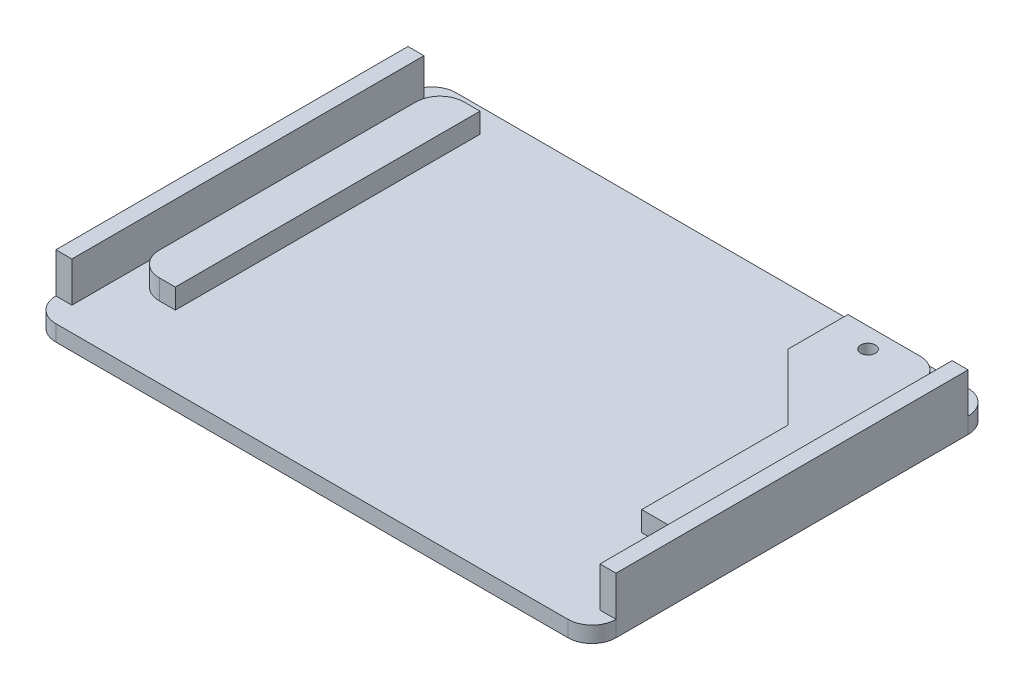
ISO-10303-21;
HEADER;
FILE_DESCRIPTION(('STEP AP214'),'2;1');
FILE_NAME('part.step','',(''),(''),'','','');
FILE_SCHEMA(('AUTOMOTIVE_DESIGN { 1 0 10303 214 1 1 1 1 }'));
ENDSEC;
DATA;
#1=APPLICATION_CONTEXT('core data for automotive mechanical design processes');
#2=APPLICATION_PROTOCOL_DEFINITION('international standard','automotive_design',2000,#1);
#3=PRODUCT_CONTEXT('',#1,'mechanical');
#4=PRODUCT('Part','Part','',(#3));
#5=PRODUCT_RELATED_PRODUCT_CATEGORY('part','',(#4));
#6=PRODUCT_DEFINITION_FORMATION('','',#4);
#7=PRODUCT_DEFINITION_CONTEXT('part definition',#1,'design');
#8=PRODUCT_DEFINITION('design','',#6,#7);
#9=PRODUCT_DEFINITION_SHAPE('','',#8);
#10=(LENGTH_UNIT() NAMED_UNIT(*) SI_UNIT(.MILLI.,.METRE.));
#11=(NAMED_UNIT(*) PLANE_ANGLE_UNIT() SI_UNIT($,.RADIAN.));
#12=(NAMED_UNIT(*) SI_UNIT($,.STERADIAN.) SOLID_ANGLE_UNIT());
#13=UNCERTAINTY_MEASURE_WITH_UNIT(LENGTH_MEASURE(1.E-05),#10,'distance_accuracy_value','');
#14=(GEOMETRIC_REPRESENTATION_CONTEXT(3) GLOBAL_UNCERTAINTY_ASSIGNED_CONTEXT((#13)) GLOBAL_UNIT_ASSIGNED_CONTEXT((#10,
#11,#12)) REPRESENTATION_CONTEXT('',''));
#15=CARTESIAN_POINT('',(0.,0.,0.));
#16=DIRECTION('',(0.,0.,1.));
#17=DIRECTION('',(1.,0.,0.));
#18=AXIS2_PLACEMENT_3D('',#15,#16,#17);
#19=CARTESIAN_POINT('',(0.,2.,0.));
#20=DIRECTION('',(0.,1.,0.));
#21=DIRECTION('',(0.,0.,1.));
#22=AXIS2_PLACEMENT_3D('',#19,#20,#21);
#23=PLANE('',#22);
#24=DIRECTION('',(-1.,0.,0.));
#25=VECTOR('',#24,1.);
#26=CARTESIAN_POINT('',(28.,2.,-22.9859711260623));
#27=LINE('',#26,#25);
#28=CARTESIAN_POINT('',(28.,2.,-22.9859711260623));
#29=VERTEX_POINT('',#28);
#30=CARTESIAN_POINT('',(19.,2.,-22.9859711260623));
#31=VERTEX_POINT('',#30);
#32=EDGE_CURVE('E303',#29,#31,#27,.T.);
#33=ORIENTED_EDGE('',*,*,#32,.F.);
#34=CARTESIAN_POINT('',(28.,2.,-19.9859711260623));
#35=DIRECTION('',(0.,1.,0.));
#36=DIRECTION('',(0.,0.,-1.));
#37=AXIS2_PLACEMENT_3D('',#34,#35,#36);
#38=CIRCLE('',#37,3.);
#39=CARTESIAN_POINT('',(31.,2.,-19.9859711260622));
#40=VERTEX_POINT('',#39);
#41=EDGE_CURVE('E254',#40,#29,#38,.T.);
#42=ORIENTED_EDGE('',*,*,#41,.F.);
#43=DIRECTION('',(0.,0.,-1.));
#44=VECTOR('',#43,1.);
#45=CARTESIAN_POINT('',(31.,2.,-19.9859711260622));
#46=LINE('',#45,#44);
#47=CARTESIAN_POINT('',(31.,2.,11.0140288739377));
#48=VERTEX_POINT('',#47);
#49=EDGE_CURVE('E281',#48,#40,#46,.T.);
#50=ORIENTED_EDGE('',*,*,#49,.F.);
#51=DIRECTION('',(1.,0.,0.));
#52=VECTOR('',#51,1.);
#53=CARTESIAN_POINT('',(31.,2.,11.0140288739377));
#54=LINE('',#53,#52);
#55=CARTESIAN_POINT('',(27.2221147720392,2.,11.0140288739377));
#56=VERTEX_POINT('',#55);
#57=EDGE_CURVE('E315',#56,#48,#54,.T.);
#58=ORIENTED_EDGE('',*,*,#57,.F.);
#59=DIRECTION('',(0.,0.,1.));
#60=VECTOR('',#59,1.);
#61=CARTESIAN_POINT('',(27.2221147720392,2.,-7.24392295753167));
#62=LINE('',#61,#60);
#63=CARTESIAN_POINT('',(27.2221147720392,2.,-7.24392295753167));
#64=VERTEX_POINT('',#63);
#65=EDGE_CURVE('E312',#64,#56,#62,.T.);
#66=ORIENTED_EDGE('',*,*,#65,.F.);
#67=DIRECTION('',(0.707106781186556,0.,0.707106781186539));
#68=VECTOR('',#67,1.);
#69=CARTESIAN_POINT('',(19.,2.,-15.4660377295707));
#70=LINE('',#69,#68);
#71=CARTESIAN_POINT('',(19.,2.,-15.4660377295707));
#72=VERTEX_POINT('',#71);
#73=EDGE_CURVE('E309',#72,#64,#70,.T.);
#74=ORIENTED_EDGE('',*,*,#73,.F.);
#75=DIRECTION('',(0.,0.,1.));
#76=VECTOR('',#75,1.);
#77=CARTESIAN_POINT('',(19.,2.,-22.9859711260623));
#78=LINE('',#77,#76);
#79=EDGE_CURVE('E306',#31,#72,#78,.T.);
#80=ORIENTED_EDGE('',*,*,#79,.F.);
#81=EDGE_LOOP('',(#33,#42,#50,#58,#66,#74,#80));
#82=FACE_BOUND('',#81,.T.);
#83=DIRECTION('',(0.,0.,1.));
#84=VECTOR('',#83,1.);
#85=CARTESIAN_POINT('',(33.,2.,-22.));
#86=LINE('',#85,#84);
#87=CARTESIAN_POINT('',(33.,2.,-22.));
#88=VERTEX_POINT('',#87);
#89=CARTESIAN_POINT('',(33.,2.,22.));
#90=VERTEX_POINT('',#89);
#91=EDGE_CURVE('E362',#88,#90,#86,.T.);
#92=ORIENTED_EDGE('',*,*,#91,.F.);
#93=DIRECTION('',(-1.,0.,0.));
#94=VECTOR('',#93,1.);
#95=CARTESIAN_POINT('',(35.,2.,-22.));
#96=LINE('',#95,#94);
#97=CARTESIAN_POINT('',(35.,2.,-22.));
#98=VERTEX_POINT('',#97);
#99=EDGE_CURVE('E367',#98,#88,#96,.T.);
#100=ORIENTED_EDGE('',*,*,#99,.F.);
#101=CARTESIAN_POINT('',(32.,2.,-22.));
#102=DIRECTION('',(0.,1.,0.));
#103=DIRECTION('',(0.,0.,1.));
#104=AXIS2_PLACEMENT_3D('',#101,#102,#103);
#105=CIRCLE('',#104,3.);
#106=CARTESIAN_POINT('',(32.,2.,-25.));
#107=VERTEX_POINT('',#106);
#108=EDGE_CURVE('E476',#98,#107,#105,.T.);
#109=ORIENTED_EDGE('',*,*,#108,.T.);
#110=DIRECTION('',(-1.,0.,0.));
#111=VECTOR('',#110,1.);
#112=CARTESIAN_POINT('',(-35.,2.,-25.));
#113=LINE('',#112,#111);
#114=CARTESIAN_POINT('',(-32.,2.,-25.));
#115=VERTEX_POINT('',#114);
#116=EDGE_CURVE('E423',#107,#115,#113,.T.);
#117=ORIENTED_EDGE('',*,*,#116,.T.);
#118=CARTESIAN_POINT('',(-32.,2.,-22.));
#119=DIRECTION('',(0.,1.,0.));
#120=DIRECTION('',(0.,0.,1.));
#121=AXIS2_PLACEMENT_3D('',#118,#119,#120);
#122=CIRCLE('',#121,3.);
#123=CARTESIAN_POINT('',(-35.,2.,-22.));
#124=VERTEX_POINT('',#123);
#125=EDGE_CURVE('E473',#115,#124,#122,.T.);
#126=ORIENTED_EDGE('',*,*,#125,.T.);
#127=DIRECTION('',(-1.,0.,0.));
#128=VECTOR('',#127,1.);
#129=CARTESIAN_POINT('',(-35.,2.,-22.));
#130=LINE('',#129,#128);
#131=CARTESIAN_POINT('',(-33.,2.,-22.));
#132=VERTEX_POINT('',#131);
#133=EDGE_CURVE('E387',#132,#124,#130,.T.);
#134=ORIENTED_EDGE('',*,*,#133,.F.);
#135=DIRECTION('',(0.,0.,-1.));
#136=VECTOR('',#135,1.);
#137=CARTESIAN_POINT('',(-33.,2.,-22.));
#138=LINE('',#137,#136);
#139=CARTESIAN_POINT('',(-33.,2.,22.));
#140=VERTEX_POINT('',#139);
#141=EDGE_CURVE('E400',#140,#132,#138,.T.);
#142=ORIENTED_EDGE('',*,*,#141,.F.);
#143=DIRECTION('',(1.,0.,0.));
#144=VECTOR('',#143,1.);
#145=CARTESIAN_POINT('',(-35.,2.,22.));
#146=LINE('',#145,#144);
#147=CARTESIAN_POINT('',(-35.,2.,22.));
#148=VERTEX_POINT('',#147);
#149=EDGE_CURVE('E370',#148,#140,#146,.T.);
#150=ORIENTED_EDGE('',*,*,#149,.F.);
#151=CARTESIAN_POINT('',(-32.,2.,22.));
#152=DIRECTION('',(0.,1.,0.));
#153=DIRECTION('',(0.,0.,1.));
#154=AXIS2_PLACEMENT_3D('',#151,#152,#153);
#155=CIRCLE('',#154,3.);
#156=CARTESIAN_POINT('',(-32.,2.,25.));
#157=VERTEX_POINT('',#156);
#158=EDGE_CURVE('E483',#148,#157,#155,.T.);
#159=ORIENTED_EDGE('',*,*,#158,.T.);
#160=DIRECTION('',(1.,0.,0.));
#161=VECTOR('',#160,1.);
#162=CARTESIAN_POINT('',(-35.,2.,25.));
#163=LINE('',#162,#161);
#164=CARTESIAN_POINT('',(32.,2.,25.));
#165=VERTEX_POINT('',#164);
#166=EDGE_CURVE('E427',#157,#165,#163,.T.);
#167=ORIENTED_EDGE('',*,*,#166,.T.);
#168=CARTESIAN_POINT('',(32.,2.,22.));
#169=DIRECTION('',(0.,1.,0.));
#170=DIRECTION('',(0.,0.,1.));
#171=AXIS2_PLACEMENT_3D('',#168,#169,#170);
#172=CIRCLE('',#171,3.);
#173=CARTESIAN_POINT('',(35.,2.,22.));
#174=VERTEX_POINT('',#173);
#175=EDGE_CURVE('E479',#165,#174,#172,.T.);
#176=ORIENTED_EDGE('',*,*,#175,.T.);
#177=DIRECTION('',(1.,0.,0.));
#178=VECTOR('',#177,1.);
#179=CARTESIAN_POINT('',(35.,2.,22.));
#180=LINE('',#179,#178);
#181=EDGE_CURVE('E359',#90,#174,#180,.T.);
#182=ORIENTED_EDGE('',*,*,#181,.F.);
#183=EDGE_LOOP('',(#92,#100,#109,#117,#126,#134,#142,#150,#159,#167,#176,#182));
#184=FACE_BOUND('',#183,.T.);
#185=DIRECTION('',(-1.,0.,0.));
#186=VECTOR('',#185,1.);
#187=CARTESIAN_POINT('',(-28.,2.,-22.));
#188=LINE('',#187,#186);
#189=CARTESIAN_POINT('',(-26.,2.,-22.));
#190=VERTEX_POINT('',#189);
#191=CARTESIAN_POINT('',(-28.,2.,-22.));
#192=VERTEX_POINT('',#191);
#193=EDGE_CURVE('E247',#190,#192,#188,.T.);
#194=ORIENTED_EDGE('',*,*,#193,.F.);
#195=DIRECTION('',(0.,0.,-1.));
#196=VECTOR('',#195,1.);
#197=CARTESIAN_POINT('',(-26.,2.,-22.));
#198=LINE('',#197,#196);
#199=CARTESIAN_POINT('',(-26.,2.,16.0717595554365));
#200=VERTEX_POINT('',#199);
#201=EDGE_CURVE('E240',#200,#190,#198,.T.);
#202=ORIENTED_EDGE('',*,*,#201,.F.);
#203=DIRECTION('',(1.,0.,0.));
#204=VECTOR('',#203,1.);
#205=CARTESIAN_POINT('',(-28.,2.,16.0717595554365));
#206=LINE('',#205,#204);
#207=CARTESIAN_POINT('',(-28.,2.,16.0717595554365));
#208=VERTEX_POINT('',#207);
#209=EDGE_CURVE('E224',#208,#200,#206,.T.);
#210=ORIENTED_EDGE('',*,*,#209,.F.);
#211=CARTESIAN_POINT('',(-28.,2.,13.0717595554365));
#212=DIRECTION('',(0.,1.,0.));
#213=DIRECTION('',(0.,0.,1.));
#214=AXIS2_PLACEMENT_3D('',#211,#212,#213);
#215=CIRCLE('',#214,3.);
#216=CARTESIAN_POINT('',(-31.,2.,13.0717595554365));
#217=VERTEX_POINT('',#216);
#218=EDGE_CURVE('E233',#217,#208,#215,.T.);
#219=ORIENTED_EDGE('',*,*,#218,.F.);
#220=DIRECTION('',(0.,0.,1.));
#221=VECTOR('',#220,1.);
#222=CARTESIAN_POINT('',(-31.,2.,-19.));
#223=LINE('',#222,#221);
#224=CARTESIAN_POINT('',(-31.,2.,-19.));
#225=VERTEX_POINT('',#224);
#226=EDGE_CURVE('E974',#225,#217,#223,.T.);
#227=ORIENTED_EDGE('',*,*,#226,.F.);
#228=CARTESIAN_POINT('',(-28.,2.,-19.));
#229=DIRECTION('',(0.,1.,0.));
#230=DIRECTION('',(0.,0.,1.));
#231=AXIS2_PLACEMENT_3D('',#228,#229,#230);
#232=CIRCLE('',#231,3.);
#233=EDGE_CURVE('E256',#192,#225,#232,.T.);
#234=ORIENTED_EDGE('',*,*,#233,.F.);
#235=EDGE_LOOP('',(#194,#202,#210,#219,#227,#234));
#236=FACE_BOUND('',#235,.T.);
#237=ADVANCED_FACE('F43',(#82,#184,#236),#23,.T.);
#238=CARTESIAN_POINT('',(35.,2.,-25.));
#239=DIRECTION('',(-1.,0.,0.));
#240=DIRECTION('',(0.,0.,1.));
#241=AXIS2_PLACEMENT_3D('',#238,#239,#240);
#242=PLANE('',#241);
#243=DIRECTION('',(0.,-1.,0.));
#244=VECTOR('',#243,1.);
#245=CARTESIAN_POINT('',(35.,2.,-22.));
#246=LINE('',#245,#244);
#247=CARTESIAN_POINT('',(35.,0.,-22.));
#248=VERTEX_POINT('',#247);
#249=EDGE_CURVE('E486',#248,#98,#246,.F.);
#250=ORIENTED_EDGE('',*,*,#249,.T.);
#251=DIRECTION('',(0.,-1.,0.));
#252=VECTOR('',#251,1.);
#253=CARTESIAN_POINT('',(35.,7.,-22.));
#254=LINE('',#253,#252);
#255=CARTESIAN_POINT('',(35.,7.,-22.));
#256=VERTEX_POINT('',#255);
#257=EDGE_CURVE('E344',#256,#98,#254,.T.);
#258=ORIENTED_EDGE('',*,*,#257,.F.);
#259=DIRECTION('',(0.,0.,-1.));
#260=VECTOR('',#259,1.);
#261=CARTESIAN_POINT('',(35.,7.,-22.));
#262=LINE('',#261,#260);
#263=CARTESIAN_POINT('',(35.,7.,22.));
#264=VERTEX_POINT('',#263);
#265=EDGE_CURVE('E363',#264,#256,#262,.T.);
#266=ORIENTED_EDGE('',*,*,#265,.F.);
#267=DIRECTION('',(0.,-1.,0.));
#268=VECTOR('',#267,1.);
#269=CARTESIAN_POINT('',(35.,7.,22.));
#270=LINE('',#269,#268);
#271=EDGE_CURVE('E354',#264,#174,#270,.T.);
#272=ORIENTED_EDGE('',*,*,#271,.T.);
#273=DIRECTION('',(0.,-1.,0.));
#274=VECTOR('',#273,1.);
#275=CARTESIAN_POINT('',(35.,2.,22.));
#276=LINE('',#275,#274);
#277=CARTESIAN_POINT('',(35.,0.,22.));
#278=VERTEX_POINT('',#277);
#279=EDGE_CURVE('E490',#174,#278,#276,.T.);
#280=ORIENTED_EDGE('',*,*,#279,.T.);
#281=DIRECTION('',(0.,0.,-1.));
#282=VECTOR('',#281,1.);
#283=CARTESIAN_POINT('',(35.,0.,-25.));
#284=LINE('',#283,#282);
#285=EDGE_CURVE('E422',#278,#248,#284,.T.);
#286=ORIENTED_EDGE('',*,*,#285,.T.);
#287=EDGE_LOOP('',(#250,#258,#266,#272,#280,#286));
#288=FACE_BOUND('',#287,.T.);
#289=ADVANCED_FACE('F545',(#288),#242,.F.);
#290=CARTESIAN_POINT('',(-35.,2.,-25.));
#291=DIRECTION('',(0.,0.,1.));
#292=DIRECTION('',(1.,0.,0.));
#293=AXIS2_PLACEMENT_3D('',#290,#291,#292);
#294=PLANE('',#293);
#295=ORIENTED_EDGE('',*,*,#116,.F.);
#296=DIRECTION('',(0.,-1.,0.));
#297=VECTOR('',#296,1.);
#298=CARTESIAN_POINT('',(32.,2.,-25.));
#299=LINE('',#298,#297);
#300=CARTESIAN_POINT('',(32.,0.,-25.));
#301=VERTEX_POINT('',#300);
#302=EDGE_CURVE('E52',#107,#301,#299,.T.);
#303=ORIENTED_EDGE('',*,*,#302,.T.);
#304=DIRECTION('',(-1.,0.,0.));
#305=VECTOR('',#304,1.);
#306=CARTESIAN_POINT('',(-35.,0.,-25.));
#307=LINE('',#306,#305);
#308=CARTESIAN_POINT('',(-32.,0.,-25.));
#309=VERTEX_POINT('',#308);
#310=EDGE_CURVE('E436',#301,#309,#307,.T.);
#311=ORIENTED_EDGE('',*,*,#310,.T.);
#312=DIRECTION('',(0.,-1.,0.));
#313=VECTOR('',#312,1.);
#314=CARTESIAN_POINT('',(-32.,2.,-25.));
#315=LINE('',#314,#313);
#316=EDGE_CURVE('E494',#309,#115,#315,.F.);
#317=ORIENTED_EDGE('',*,*,#316,.T.);
#318=EDGE_LOOP('',(#295,#303,#311,#317));
#319=FACE_BOUND('',#318,.T.);
#320=ADVANCED_FACE('F502',(#319),#294,.F.);
#321=CARTESIAN_POINT('',(-35.,2.,-25.));
#322=DIRECTION('',(1.,0.,0.));
#323=DIRECTION('',(0.,0.,-1.));
#324=AXIS2_PLACEMENT_3D('',#321,#322,#323);
#325=PLANE('',#324);
#326=DIRECTION('',(0.,0.,1.));
#327=VECTOR('',#326,1.);
#328=CARTESIAN_POINT('',(-35.,0.,-25.));
#329=LINE('',#328,#327);
#330=CARTESIAN_POINT('',(-35.,0.,-22.));
#331=VERTEX_POINT('',#330);
#332=CARTESIAN_POINT('',(-35.,0.,22.));
#333=VERTEX_POINT('',#332);
#334=EDGE_CURVE('E440',#331,#333,#329,.T.);
#335=ORIENTED_EDGE('',*,*,#334,.T.);
#336=DIRECTION('',(0.,-1.,0.));
#337=VECTOR('',#336,1.);
#338=CARTESIAN_POINT('',(-35.,2.,22.));
#339=LINE('',#338,#337);
#340=EDGE_CURVE('E469',#333,#148,#339,.F.);
#341=ORIENTED_EDGE('',*,*,#340,.T.);
#342=DIRECTION('',(0.,-1.,0.));
#343=VECTOR('',#342,1.);
#344=CARTESIAN_POINT('',(-35.,7.,22.));
#345=LINE('',#344,#343);
#346=CARTESIAN_POINT('',(-35.,7.,22.));
#347=VERTEX_POINT('',#346);
#348=EDGE_CURVE('E418',#347,#148,#345,.T.);
#349=ORIENTED_EDGE('',*,*,#348,.F.);
#350=DIRECTION('',(0.,0.,1.));
#351=VECTOR('',#350,1.);
#352=CARTESIAN_POINT('',(-35.,7.,-22.));
#353=LINE('',#352,#351);
#354=CARTESIAN_POINT('',(-35.,7.,-22.));
#355=VERTEX_POINT('',#354);
#356=EDGE_CURVE('E382',#355,#347,#353,.T.);
#357=ORIENTED_EDGE('',*,*,#356,.F.);
#358=DIRECTION('',(0.,-1.,0.));
#359=VECTOR('',#358,1.);
#360=CARTESIAN_POINT('',(-35.,7.,-22.));
#361=LINE('',#360,#359);
#362=EDGE_CURVE('E396',#355,#124,#361,.T.);
#363=ORIENTED_EDGE('',*,*,#362,.T.);
#364=DIRECTION('',(0.,-1.,0.));
#365=VECTOR('',#364,1.);
#366=CARTESIAN_POINT('',(-35.,2.,-22.));
#367=LINE('',#366,#365);
#368=EDGE_CURVE('E465',#124,#331,#367,.T.);
#369=ORIENTED_EDGE('',*,*,#368,.T.);
#370=EDGE_LOOP('',(#335,#341,#349,#357,#363,#369));
#371=FACE_BOUND('',#370,.T.);
#372=ADVANCED_FACE('F515',(#371),#325,.F.);
#373=CARTESIAN_POINT('',(-35.,2.,25.));
#374=DIRECTION('',(0.,0.,-1.));
#375=DIRECTION('',(-1.,0.,0.));
#376=AXIS2_PLACEMENT_3D('',#373,#374,#375);
#377=PLANE('',#376);
#378=ORIENTED_EDGE('',*,*,#166,.F.);
#379=DIRECTION('',(0.,-1.,0.));
#380=VECTOR('',#379,1.);
#381=CARTESIAN_POINT('',(-32.,2.,25.));
#382=LINE('',#381,#380);
#383=CARTESIAN_POINT('',(-32.,0.,25.));
#384=VERTEX_POINT('',#383);
#385=EDGE_CURVE('E449',#157,#384,#382,.T.);
#386=ORIENTED_EDGE('',*,*,#385,.T.);
#387=DIRECTION('',(1.,0.,0.));
#388=VECTOR('',#387,1.);
#389=CARTESIAN_POINT('',(-35.,0.,25.));
#390=LINE('',#389,#388);
#391=CARTESIAN_POINT('',(32.,0.,25.));
#392=VERTEX_POINT('',#391);
#393=EDGE_CURVE('E428',#384,#392,#390,.T.);
#394=ORIENTED_EDGE('',*,*,#393,.T.);
#395=DIRECTION('',(0.,-1.,0.));
#396=VECTOR('',#395,1.);
#397=CARTESIAN_POINT('',(32.,2.,25.));
#398=LINE('',#397,#396);
#399=EDGE_CURVE('E432',#392,#165,#398,.F.);
#400=ORIENTED_EDGE('',*,*,#399,.T.);
#401=EDGE_LOOP('',(#378,#386,#394,#400));
#402=FACE_BOUND('',#401,.T.);
#403=ADVANCED_FACE('F538',(#402),#377,.F.);
#404=CARTESIAN_POINT('',(0.,0.,0.));
#405=DIRECTION('',(0.,1.,0.));
#406=DIRECTION('',(0.,0.,1.));
#407=AXIS2_PLACEMENT_3D('',#404,#405,#406);
#408=PLANE('',#407);
#409=ORIENTED_EDGE('',*,*,#393,.F.);
#410=CARTESIAN_POINT('',(-32.,0.,22.));
#411=DIRECTION('',(0.,1.,0.));
#412=DIRECTION('',(0.,0.,1.));
#413=AXIS2_PLACEMENT_3D('',#410,#411,#412);
#414=CIRCLE('',#413,3.);
#415=EDGE_CURVE('E462',#384,#333,#414,.F.);
#416=ORIENTED_EDGE('',*,*,#415,.T.);
#417=ORIENTED_EDGE('',*,*,#334,.F.);
#418=CARTESIAN_POINT('',(-32.,0.,-22.));
#419=DIRECTION('',(0.,1.,0.));
#420=DIRECTION('',(0.,0.,1.));
#421=AXIS2_PLACEMENT_3D('',#418,#419,#420);
#422=CIRCLE('',#421,3.);
#423=EDGE_CURVE('E453',#331,#309,#422,.F.);
#424=ORIENTED_EDGE('',*,*,#423,.T.);
#425=ORIENTED_EDGE('',*,*,#310,.F.);
#426=CARTESIAN_POINT('',(32.,0.,-22.));
#427=DIRECTION('',(0.,1.,0.));
#428=DIRECTION('',(0.,0.,1.));
#429=AXIS2_PLACEMENT_3D('',#426,#427,#428);
#430=CIRCLE('',#429,3.);
#431=EDGE_CURVE('E456',#301,#248,#430,.F.);
#432=ORIENTED_EDGE('',*,*,#431,.T.);
#433=ORIENTED_EDGE('',*,*,#285,.F.);
#434=CARTESIAN_POINT('',(32.,0.,22.));
#435=DIRECTION('',(0.,1.,0.));
#436=DIRECTION('',(0.,0.,1.));
#437=AXIS2_PLACEMENT_3D('',#434,#435,#436);
#438=CIRCLE('',#437,3.);
#439=EDGE_CURVE('E459',#278,#392,#438,.F.);
#440=ORIENTED_EDGE('',*,*,#439,.T.);
#441=EDGE_LOOP('',(#409,#416,#417,#424,#425,#432,#433,#440));
#442=FACE_BOUND('',#441,.T.);
#443=ADVANCED_FACE('F508',(#442),#408,.F.);
#444=CARTESIAN_POINT('',(-32.,2.,22.));
#445=DIRECTION('',(0.,-1.,0.));
#446=DIRECTION('',(0.,0.,-1.));
#447=AXIS2_PLACEMENT_3D('',#444,#445,#446);
#448=CYLINDRICAL_SURFACE('',#447,3.);
#449=ORIENTED_EDGE('',*,*,#158,.F.);
#450=ORIENTED_EDGE('',*,*,#340,.F.);
#451=ORIENTED_EDGE('',*,*,#415,.F.);
#452=ORIENTED_EDGE('',*,*,#385,.F.);
#453=EDGE_LOOP('',(#449,#450,#451,#452));
#454=FACE_BOUND('',#453,.T.);
#455=ADVANCED_FACE('F536',(#454),#448,.T.);
#456=CARTESIAN_POINT('',(32.,2.,22.));
#457=DIRECTION('',(0.,-1.,0.));
#458=DIRECTION('',(0.,0.,-1.));
#459=AXIS2_PLACEMENT_3D('',#456,#457,#458);
#460=CYLINDRICAL_SURFACE('',#459,3.);
#461=ORIENTED_EDGE('',*,*,#175,.F.);
#462=ORIENTED_EDGE('',*,*,#399,.F.);
#463=ORIENTED_EDGE('',*,*,#439,.F.);
#464=ORIENTED_EDGE('',*,*,#279,.F.);
#465=EDGE_LOOP('',(#461,#462,#463,#464));
#466=FACE_BOUND('',#465,.T.);
#467=ADVANCED_FACE('F543',(#466),#460,.T.);
#468=CARTESIAN_POINT('',(32.,2.,-22.));
#469=DIRECTION('',(0.,-1.,0.));
#470=DIRECTION('',(0.,0.,-1.));
#471=AXIS2_PLACEMENT_3D('',#468,#469,#470);
#472=CYLINDRICAL_SURFACE('',#471,3.);
#473=ORIENTED_EDGE('',*,*,#108,.F.);
#474=ORIENTED_EDGE('',*,*,#249,.F.);
#475=ORIENTED_EDGE('',*,*,#431,.F.);
#476=ORIENTED_EDGE('',*,*,#302,.F.);
#477=EDGE_LOOP('',(#473,#474,#475,#476));
#478=FACE_BOUND('',#477,.T.);
#479=ADVANCED_FACE('F562',(#478),#472,.T.);
#480=CARTESIAN_POINT('',(-32.,2.,-22.));
#481=DIRECTION('',(0.,-1.,0.));
#482=DIRECTION('',(0.,0.,-1.));
#483=AXIS2_PLACEMENT_3D('',#480,#481,#482);
#484=CYLINDRICAL_SURFACE('',#483,3.);
#485=ORIENTED_EDGE('',*,*,#125,.F.);
#486=ORIENTED_EDGE('',*,*,#316,.F.);
#487=ORIENTED_EDGE('',*,*,#423,.F.);
#488=ORIENTED_EDGE('',*,*,#368,.F.);
#489=EDGE_LOOP('',(#485,#486,#487,#488));
#490=FACE_BOUND('',#489,.T.);
#491=ADVANCED_FACE('F45',(#490),#484,.T.);
#492=CARTESIAN_POINT('',(-35.,7.,22.));
#493=DIRECTION('',(0.,0.,-1.));
#494=DIRECTION('',(-1.,0.,0.));
#495=AXIS2_PLACEMENT_3D('',#492,#493,#494);
#496=PLANE('',#495);
#497=ORIENTED_EDGE('',*,*,#149,.T.);
#498=DIRECTION('',(0.,-1.,0.));
#499=VECTOR('',#498,1.);
#500=CARTESIAN_POINT('',(-33.,7.,22.));
#501=LINE('',#500,#499);
#502=CARTESIAN_POINT('',(-33.,7.,22.));
#503=VERTEX_POINT('',#502);
#504=EDGE_CURVE('E414',#503,#140,#501,.T.);
#505=ORIENTED_EDGE('',*,*,#504,.F.);
#506=DIRECTION('',(1.,0.,0.));
#507=VECTOR('',#506,1.);
#508=CARTESIAN_POINT('',(-35.,7.,22.));
#509=LINE('',#508,#507);
#510=EDGE_CURVE('E386',#347,#503,#509,.T.);
#511=ORIENTED_EDGE('',*,*,#510,.F.);
#512=ORIENTED_EDGE('',*,*,#348,.T.);
#513=EDGE_LOOP('',(#497,#505,#511,#512));
#514=FACE_BOUND('',#513,.T.);
#515=ADVANCED_FACE('F531',(#514),#496,.F.);
#516=CARTESIAN_POINT('',(-33.,7.,-22.));
#517=DIRECTION('',(-1.,0.,0.));
#518=DIRECTION('',(0.,0.,1.));
#519=AXIS2_PLACEMENT_3D('',#516,#517,#518);
#520=PLANE('',#519);
#521=ORIENTED_EDGE('',*,*,#141,.T.);
#522=DIRECTION('',(0.,-1.,0.));
#523=VECTOR('',#522,1.);
#524=CARTESIAN_POINT('',(-33.,7.,-22.));
#525=LINE('',#524,#523);
#526=CARTESIAN_POINT('',(-33.,7.,-22.));
#527=VERTEX_POINT('',#526);
#528=EDGE_CURVE('E410',#527,#132,#525,.T.);
#529=ORIENTED_EDGE('',*,*,#528,.F.);
#530=DIRECTION('',(0.,0.,-1.));
#531=VECTOR('',#530,1.);
#532=CARTESIAN_POINT('',(-33.,7.,-22.));
#533=LINE('',#532,#531);
#534=EDGE_CURVE('E390',#503,#527,#533,.T.);
#535=ORIENTED_EDGE('',*,*,#534,.F.);
#536=ORIENTED_EDGE('',*,*,#504,.T.);
#537=EDGE_LOOP('',(#521,#529,#535,#536));
#538=FACE_BOUND('',#537,.T.);
#539=ADVANCED_FACE('F527',(#538),#520,.F.);
#540=CARTESIAN_POINT('',(-35.,7.,-22.));
#541=DIRECTION('',(0.,0.,1.));
#542=DIRECTION('',(1.,0.,0.));
#543=AXIS2_PLACEMENT_3D('',#540,#541,#542);
#544=PLANE('',#543);
#545=ORIENTED_EDGE('',*,*,#133,.T.);
#546=ORIENTED_EDGE('',*,*,#362,.F.);
#547=DIRECTION('',(-1.,0.,0.));
#548=VECTOR('',#547,1.);
#549=CARTESIAN_POINT('',(-35.,7.,-22.));
#550=LINE('',#549,#548);
#551=EDGE_CURVE('E393',#527,#355,#550,.T.);
#552=ORIENTED_EDGE('',*,*,#551,.F.);
#553=ORIENTED_EDGE('',*,*,#528,.T.);
#554=EDGE_LOOP('',(#545,#546,#552,#553));
#555=FACE_BOUND('',#554,.T.);
#556=ADVANCED_FACE('F522',(#555),#544,.F.);
#557=CARTESIAN_POINT('',(0.,7.,0.));
#558=DIRECTION('',(0.,1.,0.));
#559=DIRECTION('',(0.,0.,1.));
#560=AXIS2_PLACEMENT_3D('',#557,#558,#559);
#561=PLANE('',#560);
#562=ORIENTED_EDGE('',*,*,#356,.T.);
#563=ORIENTED_EDGE('',*,*,#510,.T.);
#564=ORIENTED_EDGE('',*,*,#534,.T.);
#565=ORIENTED_EDGE('',*,*,#551,.T.);
#566=EDGE_LOOP('',(#562,#563,#564,#565));
#567=FACE_BOUND('',#566,.T.);
#568=ADVANCED_FACE('F633',(#567),#561,.T.);
#569=CARTESIAN_POINT('',(35.,7.,-22.));
#570=DIRECTION('',(0.,0.,1.));
#571=DIRECTION('',(1.,0.,0.));
#572=AXIS2_PLACEMENT_3D('',#569,#570,#571);
#573=PLANE('',#572);
#574=ORIENTED_EDGE('',*,*,#99,.T.);
#575=DIRECTION('',(0.,-1.,0.));
#576=VECTOR('',#575,1.);
#577=CARTESIAN_POINT('',(33.,7.,-22.));
#578=LINE('',#577,#576);
#579=CARTESIAN_POINT('',(33.,7.,-22.));
#580=VERTEX_POINT('',#579);
#581=EDGE_CURVE('E347',#580,#88,#578,.T.);
#582=ORIENTED_EDGE('',*,*,#581,.F.);
#583=DIRECTION('',(-1.,0.,0.));
#584=VECTOR('',#583,1.);
#585=CARTESIAN_POINT('',(35.,7.,-22.));
#586=LINE('',#585,#584);
#587=EDGE_CURVE('E376',#256,#580,#586,.T.);
#588=ORIENTED_EDGE('',*,*,#587,.F.);
#589=ORIENTED_EDGE('',*,*,#257,.T.);
#590=EDGE_LOOP('',(#574,#582,#588,#589));
#591=FACE_BOUND('',#590,.T.);
#592=ADVANCED_FACE('F561',(#591),#573,.F.);
#593=CARTESIAN_POINT('',(33.,7.,-22.));
#594=DIRECTION('',(1.,0.,0.));
#595=DIRECTION('',(0.,0.,-1.));
#596=AXIS2_PLACEMENT_3D('',#593,#594,#595);
#597=PLANE('',#596);
#598=ORIENTED_EDGE('',*,*,#91,.T.);
#599=DIRECTION('',(0.,-1.,0.));
#600=VECTOR('',#599,1.);
#601=CARTESIAN_POINT('',(33.,7.,22.));
#602=LINE('',#601,#600);
#603=CARTESIAN_POINT('',(33.,7.,22.));
#604=VERTEX_POINT('',#603);
#605=EDGE_CURVE('E351',#604,#90,#602,.T.);
#606=ORIENTED_EDGE('',*,*,#605,.F.);
#607=DIRECTION('',(0.,0.,1.));
#608=VECTOR('',#607,1.);
#609=CARTESIAN_POINT('',(33.,7.,-22.));
#610=LINE('',#609,#608);
#611=EDGE_CURVE('E373',#580,#604,#610,.T.);
#612=ORIENTED_EDGE('',*,*,#611,.F.);
#613=ORIENTED_EDGE('',*,*,#581,.T.);
#614=EDGE_LOOP('',(#598,#606,#612,#613));
#615=FACE_BOUND('',#614,.T.);
#616=ADVANCED_FACE('F558',(#615),#597,.F.);
#617=CARTESIAN_POINT('',(35.,7.,22.));
#618=DIRECTION('',(0.,0.,-1.));
#619=DIRECTION('',(-1.,0.,0.));
#620=AXIS2_PLACEMENT_3D('',#617,#618,#619);
#621=PLANE('',#620);
#622=ORIENTED_EDGE('',*,*,#181,.T.);
#623=ORIENTED_EDGE('',*,*,#271,.F.);
#624=DIRECTION('',(1.,0.,0.));
#625=VECTOR('',#624,1.);
#626=CARTESIAN_POINT('',(35.,7.,22.));
#627=LINE('',#626,#625);
#628=EDGE_CURVE('E358',#604,#264,#627,.T.);
#629=ORIENTED_EDGE('',*,*,#628,.F.);
#630=ORIENTED_EDGE('',*,*,#605,.T.);
#631=EDGE_LOOP('',(#622,#623,#629,#630));
#632=FACE_BOUND('',#631,.T.);
#633=ADVANCED_FACE('F554',(#632),#621,.F.);
#634=CARTESIAN_POINT('',(0.,7.,0.));
#635=DIRECTION('',(0.,-1.,0.));
#636=DIRECTION('',(0.,0.,-1.));
#637=AXIS2_PLACEMENT_3D('',#634,#635,#636);
#638=PLANE('',#637);
#639=ORIENTED_EDGE('',*,*,#265,.T.);
#640=ORIENTED_EDGE('',*,*,#587,.T.);
#641=ORIENTED_EDGE('',*,*,#611,.T.);
#642=ORIENTED_EDGE('',*,*,#628,.T.);
#643=EDGE_LOOP('',(#639,#640,#641,#642));
#644=FACE_BOUND('',#643,.T.);
#645=ADVANCED_FACE('F606',(#644),#638,.F.);
#646=CARTESIAN_POINT('',(28.,4.5,-19.9859711260623));
#647=DIRECTION('',(0.,-1.,0.));
#648=DIRECTION('',(0.,0.,-1.));
#649=AXIS2_PLACEMENT_3D('',#646,#647,#648);
#650=PLANE('',#649);
#651=CARTESIAN_POINT('',(28.,4.5,-19.9859711260623));
#652=DIRECTION('',(0.,1.,0.));
#653=DIRECTION('',(0.,0.,-1.));
#654=AXIS2_PLACEMENT_3D('',#651,#652,#653);
#655=CIRCLE('',#654,3.);
#656=CARTESIAN_POINT('',(31.,4.5,-19.9859711260622));
#657=VERTEX_POINT('',#656);
#658=CARTESIAN_POINT('',(28.,4.5,-22.9859711260623));
#659=VERTEX_POINT('',#658);
#660=EDGE_CURVE('E276',#657,#659,#655,.T.);
#661=ORIENTED_EDGE('',*,*,#660,.T.);
#662=DIRECTION('',(-1.,0.,0.));
#663=VECTOR('',#662,1.);
#664=CARTESIAN_POINT('',(28.,4.5,-22.9859711260623));
#665=LINE('',#664,#663);
#666=CARTESIAN_POINT('',(19.,4.5,-22.9859711260623));
#667=VERTEX_POINT('',#666);
#668=EDGE_CURVE('E280',#659,#667,#665,.T.);
#669=ORIENTED_EDGE('',*,*,#668,.T.);
#670=DIRECTION('',(0.,0.,1.));
#671=VECTOR('',#670,1.);
#672=CARTESIAN_POINT('',(19.,4.5,-22.9859711260623));
#673=LINE('',#672,#671);
#674=CARTESIAN_POINT('',(19.,4.5,-15.4660377295707));
#675=VERTEX_POINT('',#674);
#676=EDGE_CURVE('E284',#667,#675,#673,.T.);
#677=ORIENTED_EDGE('',*,*,#676,.T.);
#678=DIRECTION('',(0.707106781186556,0.,0.707106781186539));
#679=VECTOR('',#678,1.);
#680=CARTESIAN_POINT('',(19.,4.5,-15.4660377295707));
#681=LINE('',#680,#679);
#682=CARTESIAN_POINT('',(27.2221147720392,4.5,-7.24392295753167));
#683=VERTEX_POINT('',#682);
#684=EDGE_CURVE('E287',#675,#683,#681,.T.);
#685=ORIENTED_EDGE('',*,*,#684,.T.);
#686=DIRECTION('',(0.,0.,1.));
#687=VECTOR('',#686,1.);
#688=CARTESIAN_POINT('',(27.2221147720392,4.5,-7.24392295753167));
#689=LINE('',#688,#687);
#690=CARTESIAN_POINT('',(27.2221147720392,4.5,11.0140288739377));
#691=VERTEX_POINT('',#690);
#692=EDGE_CURVE('E290',#683,#691,#689,.T.);
#693=ORIENTED_EDGE('',*,*,#692,.T.);
#694=DIRECTION('',(1.,0.,0.));
#695=VECTOR('',#694,1.);
#696=CARTESIAN_POINT('',(31.,4.5,11.0140288739377));
#697=LINE('',#696,#695);
#698=CARTESIAN_POINT('',(31.,4.5,11.0140288739377));
#699=VERTEX_POINT('',#698);
#700=EDGE_CURVE('E293',#691,#699,#697,.T.);
#701=ORIENTED_EDGE('',*,*,#700,.T.);
#702=DIRECTION('',(0.,0.,-1.));
#703=VECTOR('',#702,1.);
#704=CARTESIAN_POINT('',(31.,4.5,-19.9859711260622));
#705=LINE('',#704,#703);
#706=EDGE_CURVE('E296',#699,#657,#705,.T.);
#707=ORIENTED_EDGE('',*,*,#706,.T.);
#708=EDGE_LOOP('',(#661,#669,#677,#685,#693,#701,#707));
#709=FACE_BOUND('',#708,.T.);
#710=CARTESIAN_POINT('',(24.,4.5,-20.492579920089));
#711=DIRECTION('',(0.,1.,0.));
#712=DIRECTION('',(0.,0.,1.));
#713=AXIS2_PLACEMENT_3D('',#710,#711,#712);
#714=CIRCLE('',#713,0.91);
#715=CARTESIAN_POINT('',(24.,4.5,-19.582579920089));
#716=VERTEX_POINT('',#715);
#717=EDGE_CURVE('E249',#716,#716,#714,.T.);
#718=ORIENTED_EDGE('',*,*,#717,.F.);
#719=EDGE_LOOP('',(#718));
#720=FACE_BOUND('',#719,.T.);
#721=ADVANCED_FACE('F603',(#709,#720),#650,.F.);
#722=CARTESIAN_POINT('',(28.,4.5,-19.9859711260623));
#723=DIRECTION('',(0.,-1.,0.));
#724=DIRECTION('',(0.,0.,-1.));
#725=AXIS2_PLACEMENT_3D('',#722,#723,#724);
#726=CYLINDRICAL_SURFACE('',#725,3.);
#727=ORIENTED_EDGE('',*,*,#41,.T.);
#728=DIRECTION('',(0.,-1.,0.));
#729=VECTOR('',#728,1.);
#730=CARTESIAN_POINT('',(28.,4.5,-22.9859711260623));
#731=LINE('',#730,#729);
#732=EDGE_CURVE('E341',#659,#29,#731,.T.);
#733=ORIENTED_EDGE('',*,*,#732,.F.);
#734=ORIENTED_EDGE('',*,*,#660,.F.);
#735=DIRECTION('',(0.,-1.,0.));
#736=VECTOR('',#735,1.);
#737=CARTESIAN_POINT('',(31.,4.5,-19.9859711260622));
#738=LINE('',#737,#736);
#739=EDGE_CURVE('E299',#657,#40,#738,.T.);
#740=ORIENTED_EDGE('',*,*,#739,.T.);
#741=EDGE_LOOP('',(#727,#733,#734,#740));
#742=FACE_BOUND('',#741,.T.);
#743=ADVANCED_FACE('F605',(#742),#726,.T.);
#744=CARTESIAN_POINT('',(28.,4.5,-22.9859711260623));
#745=DIRECTION('',(0.,0.,1.));
#746=DIRECTION('',(1.,0.,0.));
#747=AXIS2_PLACEMENT_3D('',#744,#745,#746);
#748=PLANE('',#747);
#749=ORIENTED_EDGE('',*,*,#32,.T.);
#750=DIRECTION('',(0.,-1.,0.));
#751=VECTOR('',#750,1.);
#752=CARTESIAN_POINT('',(19.,4.5,-22.9859711260623));
#753=LINE('',#752,#751);
#754=EDGE_CURVE('E337',#667,#31,#753,.T.);
#755=ORIENTED_EDGE('',*,*,#754,.F.);
#756=ORIENTED_EDGE('',*,*,#668,.F.);
#757=ORIENTED_EDGE('',*,*,#732,.T.);
#758=EDGE_LOOP('',(#749,#755,#756,#757));
#759=FACE_BOUND('',#758,.T.);
#760=ADVANCED_FACE('F623',(#759),#748,.F.);
#761=CARTESIAN_POINT('',(19.,4.5,-22.9859711260623));
#762=DIRECTION('',(1.,0.,0.));
#763=DIRECTION('',(0.,0.,-1.));
#764=AXIS2_PLACEMENT_3D('',#761,#762,#763);
#765=PLANE('',#764);
#766=ORIENTED_EDGE('',*,*,#79,.T.);
#767=DIRECTION('',(0.,-1.,0.));
#768=VECTOR('',#767,1.);
#769=CARTESIAN_POINT('',(19.,4.5,-15.4660377295707));
#770=LINE('',#769,#768);
#771=EDGE_CURVE('E333',#675,#72,#770,.T.);
#772=ORIENTED_EDGE('',*,*,#771,.F.);
#773=ORIENTED_EDGE('',*,*,#676,.F.);
#774=ORIENTED_EDGE('',*,*,#754,.T.);
#775=EDGE_LOOP('',(#766,#772,#773,#774));
#776=FACE_BOUND('',#775,.T.);
#777=ADVANCED_FACE('F619',(#776),#765,.F.);
#778=CARTESIAN_POINT('',(19.,4.5,-15.4660377295707));
#779=DIRECTION('',(0.707106781186539,0.,-0.707106781186556));
#780=DIRECTION('',(-0.707106781186556,0.,-0.707106781186539));
#781=AXIS2_PLACEMENT_3D('',#778,#779,#780);
#782=PLANE('',#781);
#783=ORIENTED_EDGE('',*,*,#73,.T.);
#784=DIRECTION('',(0.,-1.,0.));
#785=VECTOR('',#784,1.);
#786=CARTESIAN_POINT('',(27.2221147720392,4.5,-7.24392295753167));
#787=LINE('',#786,#785);
#788=EDGE_CURVE('E329',#683,#64,#787,.T.);
#789=ORIENTED_EDGE('',*,*,#788,.F.);
#790=ORIENTED_EDGE('',*,*,#684,.F.);
#791=ORIENTED_EDGE('',*,*,#771,.T.);
#792=EDGE_LOOP('',(#783,#789,#790,#791));
#793=FACE_BOUND('',#792,.T.);
#794=ADVANCED_FACE('F615',(#793),#782,.F.);
#795=CARTESIAN_POINT('',(27.2221147720392,4.5,-7.24392295753167));
#796=DIRECTION('',(1.,0.,0.));
#797=DIRECTION('',(0.,0.,-1.));
#798=AXIS2_PLACEMENT_3D('',#795,#796,#797);
#799=PLANE('',#798);
#800=ORIENTED_EDGE('',*,*,#65,.T.);
#801=DIRECTION('',(0.,-1.,0.));
#802=VECTOR('',#801,1.);
#803=CARTESIAN_POINT('',(27.2221147720392,4.5,11.0140288739377));
#804=LINE('',#803,#802);
#805=EDGE_CURVE('E325',#691,#56,#804,.T.);
#806=ORIENTED_EDGE('',*,*,#805,.F.);
#807=ORIENTED_EDGE('',*,*,#692,.F.);
#808=ORIENTED_EDGE('',*,*,#788,.T.);
#809=EDGE_LOOP('',(#800,#806,#807,#808));
#810=FACE_BOUND('',#809,.T.);
#811=ADVANCED_FACE('F611',(#810),#799,.F.);
#812=CARTESIAN_POINT('',(31.,4.5,11.0140288739377));
#813=DIRECTION('',(0.,0.,-1.));
#814=DIRECTION('',(-1.,0.,0.));
#815=AXIS2_PLACEMENT_3D('',#812,#813,#814);
#816=PLANE('',#815);
#817=ORIENTED_EDGE('',*,*,#57,.T.);
#818=DIRECTION('',(0.,-1.,0.));
#819=VECTOR('',#818,1.);
#820=CARTESIAN_POINT('',(31.,4.5,11.0140288739377));
#821=LINE('',#820,#819);
#822=EDGE_CURVE('E67',#699,#48,#821,.T.);
#823=ORIENTED_EDGE('',*,*,#822,.F.);
#824=ORIENTED_EDGE('',*,*,#700,.F.);
#825=ORIENTED_EDGE('',*,*,#805,.T.);
#826=EDGE_LOOP('',(#817,#823,#824,#825));
#827=FACE_BOUND('',#826,.T.);
#828=ADVANCED_FACE('F597',(#827),#816,.F.);
#829=CARTESIAN_POINT('',(31.,4.5,-19.9859711260622));
#830=DIRECTION('',(-1.,0.,0.));
#831=DIRECTION('',(0.,0.,1.));
#832=AXIS2_PLACEMENT_3D('',#829,#830,#831);
#833=PLANE('',#832);
#834=ORIENTED_EDGE('',*,*,#49,.T.);
#835=ORIENTED_EDGE('',*,*,#739,.F.);
#836=ORIENTED_EDGE('',*,*,#706,.F.);
#837=ORIENTED_EDGE('',*,*,#822,.T.);
#838=EDGE_LOOP('',(#834,#835,#836,#837));
#839=FACE_BOUND('',#838,.T.);
#840=ADVANCED_FACE('F589',(#839),#833,.F.);
#841=CARTESIAN_POINT('',(24.,4.5,-20.492579920089));
#842=DIRECTION('',(0.,-1.,0.));
#843=DIRECTION('',(0.,0.,-1.));
#844=AXIS2_PLACEMENT_3D('',#841,#842,#843);
#845=CYLINDRICAL_SURFACE('',#844,0.91);
#846=ORIENTED_EDGE('',*,*,#717,.T.);
#847=EDGE_LOOP('',(#846));
#848=FACE_BOUND('',#847,.T.);
#849=CARTESIAN_POINT('',(24.,2.,-20.492579920089));
#850=DIRECTION('',(0.,1.,0.));
#851=DIRECTION('',(0.,0.,1.));
#852=AXIS2_PLACEMENT_3D('',#849,#850,#851);
#853=CIRCLE('',#852,0.91);
#854=CARTESIAN_POINT('',(24.,2.,-19.582579920089));
#855=VERTEX_POINT('',#854);
#856=EDGE_CURVE('E11',#855,#855,#853,.F.);
#857=ORIENTED_EDGE('',*,*,#856,.T.);
#858=EDGE_LOOP('',(#857));
#859=FACE_BOUND('',#858,.T.);
#860=ADVANCED_FACE('F581',(#848,#859),#845,.F.);
#861=ORIENTED_EDGE('',*,*,#856,.F.);
#862=EDGE_LOOP('',(#861));
#863=FACE_BOUND('',#862,.T.);
#864=ADVANCED_FACE('F572',(#863),#23,.T.);
#865=CARTESIAN_POINT('',(-26.,4.5,-22.));
#866=DIRECTION('',(-1.,0.,0.));
#867=DIRECTION('',(0.,0.,1.));
#868=AXIS2_PLACEMENT_3D('',#865,#866,#867);
#869=PLANE('',#868);
#870=ORIENTED_EDGE('',*,*,#201,.T.);
#871=DIRECTION('',(0.,-1.,0.));
#872=VECTOR('',#871,1.);
#873=CARTESIAN_POINT('',(-26.,4.5,-22.));
#874=LINE('',#873,#872);
#875=CARTESIAN_POINT('',(-26.,4.5,-22.));
#876=VERTEX_POINT('',#875);
#877=EDGE_CURVE('E954',#876,#190,#874,.T.);
#878=ORIENTED_EDGE('',*,*,#877,.F.);
#879=DIRECTION('',(0.,0.,-1.));
#880=VECTOR('',#879,1.);
#881=CARTESIAN_POINT('',(-26.,4.5,-22.));
#882=LINE('',#881,#880);
#883=CARTESIAN_POINT('',(-26.,4.5,16.0717595554365));
#884=VERTEX_POINT('',#883);
#885=EDGE_CURVE('E234',#884,#876,#882,.T.);
#886=ORIENTED_EDGE('',*,*,#885,.F.);
#887=DIRECTION('',(0.,-1.,0.));
#888=VECTOR('',#887,1.);
#889=CARTESIAN_POINT('',(-26.,4.5,16.0717595554365));
#890=LINE('',#889,#888);
#891=EDGE_CURVE('E227',#884,#200,#890,.T.);
#892=ORIENTED_EDGE('',*,*,#891,.T.);
#893=EDGE_LOOP('',(#870,#878,#886,#892));
#894=FACE_BOUND('',#893,.T.);
#895=ADVANCED_FACE('F238',(#894),#869,.F.);
#896=CARTESIAN_POINT('',(-28.,4.5,-22.));
#897=DIRECTION('',(0.,0.,1.));
#898=DIRECTION('',(1.,0.,0.));
#899=AXIS2_PLACEMENT_3D('',#896,#897,#898);
#900=PLANE('',#899);
#901=ORIENTED_EDGE('',*,*,#193,.T.);
#902=DIRECTION('',(0.,-1.,0.));
#903=VECTOR('',#902,1.);
#904=CARTESIAN_POINT('',(-28.,4.5,-22.));
#905=LINE('',#904,#903);
#906=CARTESIAN_POINT('',(-28.,4.5,-22.));
#907=VERTEX_POINT('',#906);
#908=EDGE_CURVE('E956',#907,#192,#905,.T.);
#909=ORIENTED_EDGE('',*,*,#908,.F.);
#910=DIRECTION('',(-1.,0.,0.));
#911=VECTOR('',#910,1.);
#912=CARTESIAN_POINT('',(-28.,4.5,-22.));
#913=LINE('',#912,#911);
#914=EDGE_CURVE('E271',#876,#907,#913,.T.);
#915=ORIENTED_EDGE('',*,*,#914,.F.);
#916=ORIENTED_EDGE('',*,*,#877,.T.);
#917=EDGE_LOOP('',(#901,#909,#915,#916));
#918=FACE_BOUND('',#917,.T.);
#919=ADVANCED_FACE('F587',(#918),#900,.F.);
#920=CARTESIAN_POINT('',(-28.,4.5,-19.));
#921=DIRECTION('',(0.,-1.,0.));
#922=DIRECTION('',(0.,0.,-1.));
#923=AXIS2_PLACEMENT_3D('',#920,#921,#922);
#924=CYLINDRICAL_SURFACE('',#923,3.);
#925=ORIENTED_EDGE('',*,*,#233,.T.);
#926=DIRECTION('',(0.,-1.,0.));
#927=VECTOR('',#926,1.);
#928=CARTESIAN_POINT('',(-31.,4.5,-19.));
#929=LINE('',#928,#927);
#930=CARTESIAN_POINT('',(-31.,4.5,-19.));
#931=VERTEX_POINT('',#930);
#932=EDGE_CURVE('E960',#931,#225,#929,.T.);
#933=ORIENTED_EDGE('',*,*,#932,.F.);
#934=CARTESIAN_POINT('',(-28.,4.5,-19.));
#935=DIRECTION('',(0.,1.,0.));
#936=DIRECTION('',(0.,0.,1.));
#937=AXIS2_PLACEMENT_3D('',#934,#935,#936);
#938=CIRCLE('',#937,3.);
#939=EDGE_CURVE('E268',#907,#931,#938,.T.);
#940=ORIENTED_EDGE('',*,*,#939,.F.);
#941=ORIENTED_EDGE('',*,*,#908,.T.);
#942=EDGE_LOOP('',(#925,#933,#940,#941));
#943=FACE_BOUND('',#942,.T.);
#944=ADVANCED_FACE('F740',(#943),#924,.T.);
#945=CARTESIAN_POINT('',(-31.,4.5,-19.));
#946=DIRECTION('',(1.,0.,0.));
#947=DIRECTION('',(0.,0.,-1.));
#948=AXIS2_PLACEMENT_3D('',#945,#946,#947);
#949=PLANE('',#948);
#950=ORIENTED_EDGE('',*,*,#226,.T.);
#951=DIRECTION('',(0.,-1.,0.));
#952=VECTOR('',#951,1.);
#953=CARTESIAN_POINT('',(-31.,4.5,13.0717595554365));
#954=LINE('',#953,#952);
#955=CARTESIAN_POINT('',(-31.,4.5,13.0717595554365));
#956=VERTEX_POINT('',#955);
#957=EDGE_CURVE('E966',#956,#217,#954,.T.);
#958=ORIENTED_EDGE('',*,*,#957,.F.);
#959=DIRECTION('',(0.,0.,1.));
#960=VECTOR('',#959,1.);
#961=CARTESIAN_POINT('',(-31.,4.5,-19.));
#962=LINE('',#961,#960);
#963=EDGE_CURVE('E265',#931,#956,#962,.T.);
#964=ORIENTED_EDGE('',*,*,#963,.F.);
#965=ORIENTED_EDGE('',*,*,#932,.T.);
#966=EDGE_LOOP('',(#950,#958,#964,#965));
#967=FACE_BOUND('',#966,.T.);
#968=ADVANCED_FACE('F751',(#967),#949,.F.);
#969=CARTESIAN_POINT('',(-28.,4.5,13.0717595554365));
#970=DIRECTION('',(0.,-1.,0.));
#971=DIRECTION('',(0.,0.,-1.));
#972=AXIS2_PLACEMENT_3D('',#969,#970,#971);
#973=CYLINDRICAL_SURFACE('',#972,3.);
#974=ORIENTED_EDGE('',*,*,#218,.T.);
#975=DIRECTION('',(0.,-1.,0.));
#976=VECTOR('',#975,1.);
#977=CARTESIAN_POINT('',(-28.,4.5,16.0717595554365));
#978=LINE('',#977,#976);
#979=CARTESIAN_POINT('',(-28.,4.5,16.0717595554365));
#980=VERTEX_POINT('',#979);
#981=EDGE_CURVE('E59',#980,#208,#978,.T.);
#982=ORIENTED_EDGE('',*,*,#981,.F.);
#983=CARTESIAN_POINT('',(-28.,4.5,13.0717595554365));
#984=DIRECTION('',(0.,1.,0.));
#985=DIRECTION('',(0.,0.,1.));
#986=AXIS2_PLACEMENT_3D('',#983,#984,#985);
#987=CIRCLE('',#986,3.);
#988=EDGE_CURVE('E262',#956,#980,#987,.T.);
#989=ORIENTED_EDGE('',*,*,#988,.F.);
#990=ORIENTED_EDGE('',*,*,#957,.T.);
#991=EDGE_LOOP('',(#974,#982,#989,#990));
#992=FACE_BOUND('',#991,.T.);
#993=ADVANCED_FACE('F762',(#992),#973,.T.);
#994=CARTESIAN_POINT('',(-28.,4.5,16.0717595554365));
#995=DIRECTION('',(0.,0.,-1.));
#996=DIRECTION('',(-1.,0.,0.));
#997=AXIS2_PLACEMENT_3D('',#994,#995,#996);
#998=PLANE('',#997);
#999=ORIENTED_EDGE('',*,*,#209,.T.);
#1000=ORIENTED_EDGE('',*,*,#891,.F.);
#1001=DIRECTION('',(1.,0.,0.));
#1002=VECTOR('',#1001,1.);
#1003=CARTESIAN_POINT('',(-28.,4.5,16.0717595554365));
#1004=LINE('',#1003,#1002);
#1005=EDGE_CURVE('E244',#980,#884,#1004,.T.);
#1006=ORIENTED_EDGE('',*,*,#1005,.F.);
#1007=ORIENTED_EDGE('',*,*,#981,.T.);
#1008=EDGE_LOOP('',(#999,#1000,#1006,#1007));
#1009=FACE_BOUND('',#1008,.T.);
#1010=ADVANCED_FACE('F226',(#1009),#998,.F.);
#1011=CARTESIAN_POINT('',(-28.,4.5,13.0717595554365));
#1012=DIRECTION('',(0.,1.,0.));
#1013=DIRECTION('',(0.,0.,1.));
#1014=AXIS2_PLACEMENT_3D('',#1011,#1012,#1013);
#1015=PLANE('',#1014);
#1016=ORIENTED_EDGE('',*,*,#885,.T.);
#1017=ORIENTED_EDGE('',*,*,#914,.T.);
#1018=ORIENTED_EDGE('',*,*,#939,.T.);
#1019=ORIENTED_EDGE('',*,*,#963,.T.);
#1020=ORIENTED_EDGE('',*,*,#988,.T.);
#1021=ORIENTED_EDGE('',*,*,#1005,.T.);
#1022=EDGE_LOOP('',(#1016,#1017,#1018,#1019,#1020,#1021));
#1023=FACE_BOUND('',#1022,.T.);
#1024=ADVANCED_FACE('F601',(#1023),#1015,.T.);
#1025=CLOSED_SHELL('',(#237,#289,#320,#372,#403,#443,#455,#467,#479,#491,#515,#539,#556,#568,
#592,#616,#633,#645,#721,#743,#760,#777,#794,#811,#828,#840,#860,#864,#895,#919,#944,#968,#993,
#1010,#1024));
#1026=MANIFOLD_SOLID_BREP('B2',#1025);
#1027=ADVANCED_BREP_SHAPE_REPRESENTATION('',(#18,#1026),#14);
#1028=SHAPE_DEFINITION_REPRESENTATION(#9,#1027);
ENDSEC;
END-ISO-10303-21;
